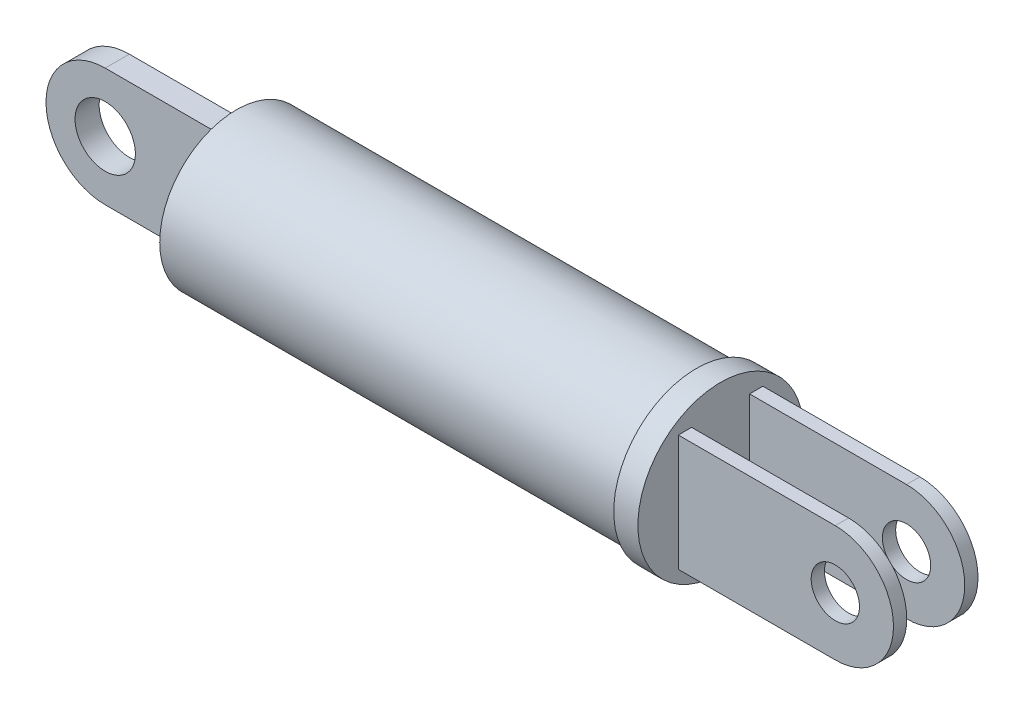
ISO-10303-21;
HEADER;
FILE_DESCRIPTION(('STEP AP214'),'2;1');
FILE_NAME('part.step','',(''),(''),'','','');
FILE_SCHEMA(('AUTOMOTIVE_DESIGN { 1 0 10303 214 1 1 1 1 }'));
ENDSEC;
DATA;
#1=APPLICATION_CONTEXT('core data for automotive mechanical design processes');
#2=APPLICATION_PROTOCOL_DEFINITION('international standard','automotive_design',2000,#1);
#3=PRODUCT_CONTEXT('',#1,'mechanical');
#4=PRODUCT('Part','Part','',(#3));
#5=PRODUCT_RELATED_PRODUCT_CATEGORY('part','',(#4));
#6=PRODUCT_DEFINITION_FORMATION('','',#4);
#7=PRODUCT_DEFINITION_CONTEXT('part definition',#1,'design');
#8=PRODUCT_DEFINITION('design','',#6,#7);
#9=PRODUCT_DEFINITION_SHAPE('','',#8);
#10=(LENGTH_UNIT() NAMED_UNIT(*) SI_UNIT(.MILLI.,.METRE.));
#11=(NAMED_UNIT(*) PLANE_ANGLE_UNIT() SI_UNIT($,.RADIAN.));
#12=(NAMED_UNIT(*) SI_UNIT($,.STERADIAN.) SOLID_ANGLE_UNIT());
#13=UNCERTAINTY_MEASURE_WITH_UNIT(LENGTH_MEASURE(1.E-05),#10,'distance_accuracy_value','');
#14=(GEOMETRIC_REPRESENTATION_CONTEXT(3) GLOBAL_UNCERTAINTY_ASSIGNED_CONTEXT((#13)) GLOBAL_UNIT_ASSIGNED_CONTEXT((#10,
#11,#12)) REPRESENTATION_CONTEXT('',''));
#15=CARTESIAN_POINT('',(0.,0.,0.));
#16=DIRECTION('',(0.,0.,1.));
#17=DIRECTION('',(1.,0.,0.));
#18=AXIS2_PLACEMENT_3D('',#15,#16,#17);
#19=CARTESIAN_POINT('',(80.2,-9.63566644208569,7.));
#20=DIRECTION('',(0.,1.,0.));
#21=DIRECTION('',(0.,0.,1.));
#22=AXIS2_PLACEMENT_3D('',#19,#20,#21);
#23=PLANE('',#22);
#24=DIRECTION('',(0.,0.,-1.));
#25=VECTOR('',#24,1.);
#26=CARTESIAN_POINT('',(106.2,-9.63566644208569,7.));
#27=LINE('',#26,#25);
#28=CARTESIAN_POINT('',(106.2,-9.63566644208569,-4.80121317375935));
#29=VERTEX_POINT('',#28);
#30=CARTESIAN_POINT('',(106.2,-9.63566644208569,-7.));
#31=VERTEX_POINT('',#30);
#32=EDGE_CURVE('E316',#29,#31,#27,.T.);
#33=ORIENTED_EDGE('',*,*,#32,.F.);
#34=DIRECTION('',(-1.,0.,0.));
#35=VECTOR('',#34,1.);
#36=CARTESIAN_POINT('',(80.2,-9.63566644208569,-4.80121317375934));
#37=LINE('',#36,#35);
#38=CARTESIAN_POINT('',(80.2,-9.63566644208569,-4.80121317375934));
#39=VERTEX_POINT('',#38);
#40=EDGE_CURVE('E278',#29,#39,#37,.T.);
#41=ORIENTED_EDGE('',*,*,#40,.T.);
#42=DIRECTION('',(0.,0.,-1.));
#43=VECTOR('',#42,1.);
#44=CARTESIAN_POINT('',(80.2,-9.63566644208569,7.));
#45=LINE('',#44,#43);
#46=CARTESIAN_POINT('',(80.2,-9.63566644208569,-7.));
#47=VERTEX_POINT('',#46);
#48=EDGE_CURVE('E185',#39,#47,#45,.T.);
#49=ORIENTED_EDGE('',*,*,#48,.T.);
#50=DIRECTION('',(1.,0.,0.));
#51=VECTOR('',#50,1.);
#52=CARTESIAN_POINT('',(80.2,-9.63566644208569,-7.));
#53=LINE('',#52,#51);
#54=EDGE_CURVE('E300',#47,#31,#53,.T.);
#55=ORIENTED_EDGE('',*,*,#54,.T.);
#56=EDGE_LOOP('',(#33,#41,#49,#55));
#57=FACE_BOUND('',#56,.T.);
#58=ADVANCED_FACE('F42',(#57),#23,.F.);
#59=CARTESIAN_POINT('',(106.2,0.,7.));
#60=DIRECTION('',(0.,0.,-1.));
#61=DIRECTION('',(-1.,0.,0.));
#62=AXIS2_PLACEMENT_3D('',#59,#60,#61);
#63=CYLINDRICAL_SURFACE('',#62,9.63566644208569);
#64=DIRECTION('',(0.,0.,-1.));
#65=VECTOR('',#64,1.);
#66=CARTESIAN_POINT('',(106.2,9.63566644208569,7.));
#67=LINE('',#66,#65);
#68=CARTESIAN_POINT('',(106.2,9.63566644208569,-4.80121317375935));
#69=VERTEX_POINT('',#68);
#70=CARTESIAN_POINT('',(106.2,9.63566644208569,-7.));
#71=VERTEX_POINT('',#70);
#72=EDGE_CURVE('E312',#69,#71,#67,.T.);
#73=ORIENTED_EDGE('',*,*,#72,.F.);
#74=CARTESIAN_POINT('',(106.2,0.,-4.80121317375935));
#75=DIRECTION('',(0.,0.,-1.));
#76=DIRECTION('',(-1.,0.,0.));
#77=AXIS2_PLACEMENT_3D('',#74,#75,#76);
#78=CIRCLE('',#77,9.63566644208569);
#79=EDGE_CURVE('E274',#69,#29,#78,.T.);
#80=ORIENTED_EDGE('',*,*,#79,.T.);
#81=ORIENTED_EDGE('',*,*,#32,.T.);
#82=CARTESIAN_POINT('',(106.2,0.,-7.));
#83=DIRECTION('',(0.,0.,1.));
#84=DIRECTION('',(-1.,0.,0.));
#85=AXIS2_PLACEMENT_3D('',#82,#83,#84);
#86=CIRCLE('',#85,9.63566644208569);
#87=EDGE_CURVE('E304',#31,#71,#86,.T.);
#88=ORIENTED_EDGE('',*,*,#87,.T.);
#89=EDGE_LOOP('',(#73,#80,#81,#88));
#90=FACE_BOUND('',#89,.T.);
#91=ADVANCED_FACE('F328',(#90),#63,.T.);
#92=CARTESIAN_POINT('',(80.2,9.63566644208569,7.));
#93=DIRECTION('',(0.,-1.,0.));
#94=DIRECTION('',(0.,0.,-1.));
#95=AXIS2_PLACEMENT_3D('',#92,#93,#94);
#96=PLANE('',#95);
#97=DIRECTION('',(0.,0.,-1.));
#98=VECTOR('',#97,1.);
#99=CARTESIAN_POINT('',(80.2,9.63566644208569,7.));
#100=LINE('',#99,#98);
#101=CARTESIAN_POINT('',(80.2,9.63566644208569,-4.80121317375934));
#102=VERTEX_POINT('',#101);
#103=CARTESIAN_POINT('',(80.2,9.63566644208569,-7.));
#104=VERTEX_POINT('',#103);
#105=EDGE_CURVE('E74',#102,#104,#100,.T.);
#106=ORIENTED_EDGE('',*,*,#105,.F.);
#107=DIRECTION('',(1.,0.,0.));
#108=VECTOR('',#107,1.);
#109=CARTESIAN_POINT('',(80.2,9.63566644208569,-4.80121317375934));
#110=LINE('',#109,#108);
#111=EDGE_CURVE('E270',#102,#69,#110,.T.);
#112=ORIENTED_EDGE('',*,*,#111,.T.);
#113=ORIENTED_EDGE('',*,*,#72,.T.);
#114=DIRECTION('',(-1.,0.,0.));
#115=VECTOR('',#114,1.);
#116=CARTESIAN_POINT('',(80.2,9.63566644208569,-7.));
#117=LINE('',#116,#115);
#118=EDGE_CURVE('E292',#71,#104,#117,.T.);
#119=ORIENTED_EDGE('',*,*,#118,.T.);
#120=EDGE_LOOP('',(#106,#112,#113,#119));
#121=FACE_BOUND('',#120,.T.);
#122=ADVANCED_FACE('F324',(#121),#96,.F.);
#123=CARTESIAN_POINT('',(106.2,0.,7.));
#124=DIRECTION('',(0.,0.,-1.));
#125=DIRECTION('',(-1.,0.,0.));
#126=AXIS2_PLACEMENT_3D('',#123,#124,#125);
#127=CYLINDRICAL_SURFACE('',#126,4.00000000000001);
#128=CARTESIAN_POINT('',(106.2,0.,-4.80121317375935));
#129=DIRECTION('',(0.,0.,-1.));
#130=DIRECTION('',(-1.,0.,0.));
#131=AXIS2_PLACEMENT_3D('',#128,#129,#130);
#132=CIRCLE('',#131,4.00000000000001);
#133=CARTESIAN_POINT('',(102.2,0.,-4.80121317375935));
#134=VERTEX_POINT('',#133);
#135=EDGE_CURVE('E46',#134,#134,#132,.T.);
#136=ORIENTED_EDGE('',*,*,#135,.F.);
#137=EDGE_LOOP('',(#136));
#138=FACE_BOUND('',#137,.T.);
#139=CARTESIAN_POINT('',(106.2,0.,-7.));
#140=DIRECTION('',(0.,0.,1.));
#141=DIRECTION('',(1.,0.,0.));
#142=AXIS2_PLACEMENT_3D('',#139,#140,#141);
#143=CIRCLE('',#142,4.00000000000001);
#144=CARTESIAN_POINT('',(110.2,0.,-7.));
#145=VERTEX_POINT('',#144);
#146=EDGE_CURVE('E282',#145,#145,#143,.T.);
#147=ORIENTED_EDGE('',*,*,#146,.F.);
#148=EDGE_LOOP('',(#147));
#149=FACE_BOUND('',#148,.T.);
#150=ADVANCED_FACE('F349',(#138,#149),#127,.F.);
#151=CARTESIAN_POINT('',(80.2,0.,0.));
#152=DIRECTION('',(1.,0.,0.));
#153=DIRECTION('',(0.,0.,-1.));
#154=AXIS2_PLACEMENT_3D('',#151,#152,#153);
#155=PLANE('',#154);
#156=ORIENTED_EDGE('',*,*,#48,.F.);
#157=DIRECTION('',(0.,1.,0.));
#158=VECTOR('',#157,1.);
#159=CARTESIAN_POINT('',(80.2,-13.7,-4.80121317375934));
#160=LINE('',#159,#158);
#161=EDGE_CURVE('E178',#39,#102,#160,.T.);
#162=ORIENTED_EDGE('',*,*,#161,.T.);
#163=ORIENTED_EDGE('',*,*,#105,.T.);
#164=DIRECTION('',(0.,-1.,0.));
#165=VECTOR('',#164,1.);
#166=CARTESIAN_POINT('',(80.2,9.63566644208569,-7.));
#167=LINE('',#166,#165);
#168=EDGE_CURVE('E286',#104,#47,#167,.T.);
#169=ORIENTED_EDGE('',*,*,#168,.T.);
#170=EDGE_LOOP('',(#156,#162,#163,#169));
#171=FACE_BOUND('',#170,.T.);
#172=CARTESIAN_POINT('',(80.2,9.63566644208569,7.));
#173=VERTEX_POINT('',#172);
#174=CARTESIAN_POINT('',(80.2,9.63566644208569,4.80121317375941));
#175=VERTEX_POINT('',#174);
#176=EDGE_CURVE('E176',#173,#175,#100,.T.);
#177=ORIENTED_EDGE('',*,*,#176,.T.);
#178=DIRECTION('',(0.,1.,0.));
#179=VECTOR('',#178,1.);
#180=CARTESIAN_POINT('',(80.2,-13.7,4.80121317375941));
#181=LINE('',#180,#179);
#182=CARTESIAN_POINT('',(80.2,-9.63566644208569,4.80121317375941));
#183=VERTEX_POINT('',#182);
#184=EDGE_CURVE('E63',#183,#175,#181,.T.);
#185=ORIENTED_EDGE('',*,*,#184,.F.);
#186=CARTESIAN_POINT('',(80.2,-9.63566644208569,7.));
#187=VERTEX_POINT('',#186);
#188=EDGE_CURVE('E174',#187,#183,#45,.T.);
#189=ORIENTED_EDGE('',*,*,#188,.F.);
#190=DIRECTION('',(0.,-1.,0.));
#191=VECTOR('',#190,1.);
#192=CARTESIAN_POINT('',(80.2,9.63566644208569,7.));
#193=LINE('',#192,#191);
#194=EDGE_CURVE('E290',#173,#187,#193,.T.);
#195=ORIENTED_EDGE('',*,*,#194,.F.);
#196=EDGE_LOOP('',(#177,#185,#189,#195));
#197=FACE_BOUND('',#196,.T.);
#198=CARTESIAN_POINT('',(80.2,0.,0.));
#199=DIRECTION('',(1.,0.,0.));
#200=DIRECTION('',(0.,0.,-1.));
#201=AXIS2_PLACEMENT_3D('',#198,#199,#200);
#202=CIRCLE('',#201,13.7);
#203=CARTESIAN_POINT('',(80.2,0.,-13.7));
#204=VERTEX_POINT('',#203);
#205=EDGE_CURVE('E191',#204,#204,#202,.T.);
#206=ORIENTED_EDGE('',*,*,#205,.T.);
#207=EDGE_LOOP('',(#206));
#208=FACE_BOUND('',#207,.T.);
#209=ADVANCED_FACE('F171',(#171,#197,#208),#155,.T.);
#210=CARTESIAN_POINT('',(0.,0.,0.));
#211=DIRECTION('',(1.,0.,0.));
#212=DIRECTION('',(0.,0.,-1.));
#213=AXIS2_PLACEMENT_3D('',#210,#211,#212);
#214=PLANE('',#213);
#215=CARTESIAN_POINT('',(0.,0.,0.));
#216=DIRECTION('',(1.,0.,0.));
#217=DIRECTION('',(0.,0.,-1.));
#218=AXIS2_PLACEMENT_3D('',#215,#216,#217);
#219=CIRCLE('',#218,12.7);
#220=CARTESIAN_POINT('',(0.,0.,12.7));
#221=VERTEX_POINT('',#220);
#222=EDGE_CURVE('E52',#221,#221,#219,.T.);
#223=ORIENTED_EDGE('',*,*,#222,.F.);
#224=EDGE_LOOP('',(#223));
#225=FACE_BOUND('',#224,.T.);
#226=DIRECTION('',(0.,0.,-1.));
#227=VECTOR('',#226,1.);
#228=CARTESIAN_POINT('',(0.,9.80568754770044,2.));
#229=LINE('',#228,#227);
#230=CARTESIAN_POINT('',(0.,9.80568754770044,2.));
#231=VERTEX_POINT('',#230);
#232=CARTESIAN_POINT('',(0.,9.80568754770044,-2.));
#233=VERTEX_POINT('',#232);
#234=EDGE_CURVE('E247',#231,#233,#229,.T.);
#235=ORIENTED_EDGE('',*,*,#234,.F.);
#236=DIRECTION('',(0.,1.,0.));
#237=VECTOR('',#236,1.);
#238=CARTESIAN_POINT('',(0.,9.80568754770044,2.));
#239=LINE('',#238,#237);
#240=CARTESIAN_POINT('',(0.,-9.80568754770044,2.));
#241=VERTEX_POINT('',#240);
#242=EDGE_CURVE('E210',#241,#231,#239,.T.);
#243=ORIENTED_EDGE('',*,*,#242,.F.);
#244=DIRECTION('',(0.,0.,-1.));
#245=VECTOR('',#244,1.);
#246=CARTESIAN_POINT('',(0.,-9.80568754770044,2.));
#247=LINE('',#246,#245);
#248=CARTESIAN_POINT('',(0.,-9.80568754770044,-2.));
#249=VERTEX_POINT('',#248);
#250=EDGE_CURVE('E225',#241,#249,#247,.T.);
#251=ORIENTED_EDGE('',*,*,#250,.T.);
#252=DIRECTION('',(0.,1.,0.));
#253=VECTOR('',#252,1.);
#254=CARTESIAN_POINT('',(0.,9.80568754770044,-2.));
#255=LINE('',#254,#253);
#256=EDGE_CURVE('E206',#249,#233,#255,.T.);
#257=ORIENTED_EDGE('',*,*,#256,.T.);
#258=EDGE_LOOP('',(#235,#243,#251,#257));
#259=FACE_BOUND('',#258,.T.);
#260=ADVANCED_FACE('F385',(#225,#259),#214,.F.);
#261=CARTESIAN_POINT('',(76.2,0.,0.));
#262=DIRECTION('',(-1.,0.,0.));
#263=DIRECTION('',(0.,0.,1.));
#264=AXIS2_PLACEMENT_3D('',#261,#262,#263);
#265=CYLINDRICAL_SURFACE('',#264,12.7);
#266=CARTESIAN_POINT('',(76.2,0.,0.));
#267=DIRECTION('',(1.,0.,0.));
#268=DIRECTION('',(0.,0.,-1.));
#269=AXIS2_PLACEMENT_3D('',#266,#267,#268);
#270=CIRCLE('',#269,12.7);
#271=CARTESIAN_POINT('',(76.2,0.,12.7));
#272=VERTEX_POINT('',#271);
#273=EDGE_CURVE('E11',#272,#272,#270,.T.);
#274=CARTESIAN_POINT('',(76.2,0.,12.7));
#275=CARTESIAN_POINT('',(75.40625,0.,12.7));
#276=CARTESIAN_POINT('',(74.6125,0.,12.7));
#277=CARTESIAN_POINT('',(73.025,0.,12.7));
#278=CARTESIAN_POINT('',(72.23125,0.,12.7));
#279=CARTESIAN_POINT('',(70.64375,0.,12.7));
#280=CARTESIAN_POINT('',(69.85,0.,12.7));
#281=CARTESIAN_POINT('',(68.2625,0.,12.7));
#282=CARTESIAN_POINT('',(67.46875,0.,12.7));
#283=CARTESIAN_POINT('',(65.88125,0.,12.7));
#284=CARTESIAN_POINT('',(65.0875,0.,12.7));
#285=CARTESIAN_POINT('',(63.5,0.,12.7));
#286=CARTESIAN_POINT('',(62.70625,0.,12.7));
#287=CARTESIAN_POINT('',(61.11875,0.,12.7));
#288=CARTESIAN_POINT('',(60.325,0.,12.7));
#289=CARTESIAN_POINT('',(58.7375,0.,12.7));
#290=CARTESIAN_POINT('',(57.94375,0.,12.7));
#291=CARTESIAN_POINT('',(56.35625,0.,12.7));
#292=CARTESIAN_POINT('',(55.5625,0.,12.7));
#293=CARTESIAN_POINT('',(53.975,0.,12.7));
#294=CARTESIAN_POINT('',(53.18125,0.,12.7));
#295=CARTESIAN_POINT('',(51.59375,0.,12.7));
#296=CARTESIAN_POINT('',(50.8,0.,12.7));
#297=CARTESIAN_POINT('',(49.2125,0.,12.7));
#298=CARTESIAN_POINT('',(48.41875,0.,12.7));
#299=CARTESIAN_POINT('',(46.83125,0.,12.7));
#300=CARTESIAN_POINT('',(46.0375,0.,12.7));
#301=CARTESIAN_POINT('',(44.45,0.,12.7));
#302=CARTESIAN_POINT('',(43.65625,0.,12.7));
#303=CARTESIAN_POINT('',(42.06875,0.,12.7));
#304=CARTESIAN_POINT('',(41.275,0.,12.7));
#305=CARTESIAN_POINT('',(39.6875,0.,12.7));
#306=CARTESIAN_POINT('',(38.89375,0.,12.7));
#307=CARTESIAN_POINT('',(37.30625,0.,12.7));
#308=CARTESIAN_POINT('',(36.5125,0.,12.7));
#309=CARTESIAN_POINT('',(34.925,0.,12.7));
#310=CARTESIAN_POINT('',(34.13125,0.,12.7));
#311=CARTESIAN_POINT('',(32.54375,0.,12.7));
#312=CARTESIAN_POINT('',(31.75,0.,12.7));
#313=CARTESIAN_POINT('',(30.1625,0.,12.7));
#314=CARTESIAN_POINT('',(29.36875,0.,12.7));
#315=CARTESIAN_POINT('',(27.78125,0.,12.7));
#316=CARTESIAN_POINT('',(26.9875,0.,12.7));
#317=CARTESIAN_POINT('',(25.4,0.,12.7));
#318=CARTESIAN_POINT('',(24.60625,0.,12.7));
#319=CARTESIAN_POINT('',(23.01875,0.,12.7));
#320=CARTESIAN_POINT('',(22.225,0.,12.7));
#321=CARTESIAN_POINT('',(20.6375,0.,12.7));
#322=CARTESIAN_POINT('',(19.84375,0.,12.7));
#323=CARTESIAN_POINT('',(18.25625,0.,12.7));
#324=CARTESIAN_POINT('',(17.4625,0.,12.7));
#325=CARTESIAN_POINT('',(15.875,0.,12.7));
#326=CARTESIAN_POINT('',(15.08125,0.,12.7));
#327=CARTESIAN_POINT('',(13.49375,0.,12.7));
#328=CARTESIAN_POINT('',(12.7,0.,12.7));
#329=CARTESIAN_POINT('',(11.1125,0.,12.7));
#330=CARTESIAN_POINT('',(10.31875,0.,12.7));
#331=CARTESIAN_POINT('',(8.73125,0.,12.7));
#332=CARTESIAN_POINT('',(7.93750000000001,0.,12.7));
#333=CARTESIAN_POINT('',(6.35,0.,12.7));
#334=CARTESIAN_POINT('',(5.55625,0.,12.7));
#335=CARTESIAN_POINT('',(3.96875,0.,12.7));
#336=CARTESIAN_POINT('',(3.175,0.,12.7));
#337=CARTESIAN_POINT('',(1.5875,0.,12.7));
#338=CARTESIAN_POINT('',(0.793750000000001,0.,12.7));
#339=CARTESIAN_POINT('',(0.,0.,12.7));
#340=B_SPLINE_CURVE_WITH_KNOTS('',3,(#274,#275,#276,#277,#278,#279,#280,#281,#282,#283,#284,
#285,#286,#287,#288,#289,#290,#291,#292,#293,#294,#295,#296,#297,#298,#299,#300,#301,#302,#303,
#304,#305,#306,#307,#308,#309,#310,#311,#312,#313,#314,#315,#316,#317,#318,#319,#320,#321,#322,
#323,#324,#325,#326,#327,#328,#329,#330,#331,#332,#333,#334,#335,#336,#337,#338,#339),
.UNSPECIFIED.,.F.,.F.,(4,2,2,2,2,2,2,2,2,2,2,2,2,2,2,2,2,2,2,2,2,2,2,2,2,2,2,2,2,2,2,2,4),(0.,
2.38124999999999,4.76249999999999,7.14374999999999,9.52499999999999,11.90625,14.2875,16.66875,
19.05,21.43125,23.8125,26.19375,28.575,30.95625,33.3375,35.71875,38.1,40.48125,42.8625,45.24375,
47.625,50.00625,52.3875,54.76875,57.15,59.53125,61.9125,64.29375,66.675,69.05625,71.4375,
73.81875,76.2),.UNSPECIFIED.);
#341=EDGE_CURVE('BSEAM44',#272,#221,#340,.T.);
#342=ORIENTED_EDGE('',*,*,#273,.F.);
#343=ORIENTED_EDGE('',*,*,#222,.T.);
#344=ORIENTED_EDGE('',*,*,#341,.T.);
#345=ORIENTED_EDGE('',*,*,#341,.F.);
#346=EDGE_LOOP('',(#342,#344,#343,#345));
#347=FACE_BOUND('',#346,.T.);
#348=ADVANCED_FACE('F44',(#347),#265,.T.);
#349=CARTESIAN_POINT('',(-19.7330944718316,0.,2.));
#350=DIRECTION('',(0.,0.,1.));
#351=DIRECTION('',(1.,0.,0.));
#352=AXIS2_PLACEMENT_3D('',#349,#350,#351);
#353=PLANE('',#352);
#354=ORIENTED_EDGE('',*,*,#242,.T.);
#355=DIRECTION('',(-1.,0.,0.));
#356=VECTOR('',#355,1.);
#357=CARTESIAN_POINT('',(0.,9.80568754770044,2.));
#358=LINE('',#357,#356);
#359=CARTESIAN_POINT('',(-19.7330944718316,9.80568754770044,2.));
#360=VERTEX_POINT('',#359);
#361=EDGE_CURVE('E214',#231,#360,#358,.T.);
#362=ORIENTED_EDGE('',*,*,#361,.T.);
#363=CARTESIAN_POINT('',(-19.7330944718316,0.,2.));
#364=DIRECTION('',(0.,0.,1.));
#365=DIRECTION('',(1.,0.,0.));
#366=AXIS2_PLACEMENT_3D('',#363,#364,#365);
#367=CIRCLE('',#366,9.80568754770044);
#368=CARTESIAN_POINT('',(-19.7330944718316,-9.80568754770044,2.));
#369=VERTEX_POINT('',#368);
#370=EDGE_CURVE('E218',#360,#369,#367,.T.);
#371=ORIENTED_EDGE('',*,*,#370,.T.);
#372=DIRECTION('',(1.,0.,0.));
#373=VECTOR('',#372,1.);
#374=CARTESIAN_POINT('',(0.,-9.80568754770044,2.));
#375=LINE('',#374,#373);
#376=EDGE_CURVE('E221',#369,#241,#375,.T.);
#377=ORIENTED_EDGE('',*,*,#376,.T.);
#378=EDGE_LOOP('',(#354,#362,#371,#377));
#379=FACE_BOUND('',#378,.T.);
#380=CARTESIAN_POINT('',(-19.7330944718316,0.,2.));
#381=DIRECTION('',(0.,0.,1.));
#382=DIRECTION('',(1.,0.,0.));
#383=AXIS2_PLACEMENT_3D('',#380,#381,#382);
#384=CIRCLE('',#383,5.);
#385=CARTESIAN_POINT('',(-14.7330944718316,0.,2.));
#386=VERTEX_POINT('',#385);
#387=EDGE_CURVE('E202',#386,#386,#384,.T.);
#388=ORIENTED_EDGE('',*,*,#387,.F.);
#389=EDGE_LOOP('',(#388));
#390=FACE_BOUND('',#389,.T.);
#391=ADVANCED_FACE('F413',(#379,#390),#353,.T.);
#392=CARTESIAN_POINT('',(-19.7330944718316,0.,-2.));
#393=DIRECTION('',(0.,0.,1.));
#394=DIRECTION('',(1.,0.,0.));
#395=AXIS2_PLACEMENT_3D('',#392,#393,#394);
#396=PLANE('',#395);
#397=ORIENTED_EDGE('',*,*,#256,.F.);
#398=DIRECTION('',(1.,0.,0.));
#399=VECTOR('',#398,1.);
#400=CARTESIAN_POINT('',(0.,-9.80568754770044,-2.));
#401=LINE('',#400,#399);
#402=CARTESIAN_POINT('',(-19.7330944718316,-9.80568754770044,-2.));
#403=VERTEX_POINT('',#402);
#404=EDGE_CURVE('E215',#403,#249,#401,.T.);
#405=ORIENTED_EDGE('',*,*,#404,.F.);
#406=CARTESIAN_POINT('',(-19.7330944718316,0.,-2.));
#407=DIRECTION('',(0.,0.,1.));
#408=DIRECTION('',(1.,0.,0.));
#409=AXIS2_PLACEMENT_3D('',#406,#407,#408);
#410=CIRCLE('',#409,9.80568754770044);
#411=CARTESIAN_POINT('',(-19.7330944718316,9.80568754770044,-2.));
#412=VERTEX_POINT('',#411);
#413=EDGE_CURVE('E231',#412,#403,#410,.T.);
#414=ORIENTED_EDGE('',*,*,#413,.F.);
#415=DIRECTION('',(-1.,0.,0.));
#416=VECTOR('',#415,1.);
#417=CARTESIAN_POINT('',(0.,9.80568754770044,-2.));
#418=LINE('',#417,#416);
#419=EDGE_CURVE('E228',#233,#412,#418,.T.);
#420=ORIENTED_EDGE('',*,*,#419,.F.);
#421=EDGE_LOOP('',(#397,#405,#414,#420));
#422=FACE_BOUND('',#421,.T.);
#423=CARTESIAN_POINT('',(-19.7330944718316,0.,-2.));
#424=DIRECTION('',(0.,0.,1.));
#425=DIRECTION('',(1.,0.,0.));
#426=AXIS2_PLACEMENT_3D('',#423,#424,#425);
#427=CIRCLE('',#426,5.);
#428=CARTESIAN_POINT('',(-14.7330944718316,0.,-2.));
#429=VERTEX_POINT('',#428);
#430=EDGE_CURVE('E200',#429,#429,#427,.T.);
#431=ORIENTED_EDGE('',*,*,#430,.T.);
#432=EDGE_LOOP('',(#431));
#433=FACE_BOUND('',#432,.T.);
#434=ADVANCED_FACE('F416',(#422,#433),#396,.F.);
#435=CARTESIAN_POINT('',(0.,9.80568754770044,2.));
#436=DIRECTION('',(0.,-1.,0.));
#437=DIRECTION('',(1.,0.,0.));
#438=AXIS2_PLACEMENT_3D('',#435,#436,#437);
#439=PLANE('',#438);
#440=ORIENTED_EDGE('',*,*,#419,.T.);
#441=DIRECTION('',(0.,0.,-1.));
#442=VECTOR('',#441,1.);
#443=CARTESIAN_POINT('',(-19.7330944718316,9.80568754770044,2.));
#444=LINE('',#443,#442);
#445=EDGE_CURVE('E243',#360,#412,#444,.T.);
#446=ORIENTED_EDGE('',*,*,#445,.F.);
#447=ORIENTED_EDGE('',*,*,#361,.F.);
#448=ORIENTED_EDGE('',*,*,#234,.T.);
#449=EDGE_LOOP('',(#440,#446,#447,#448));
#450=FACE_BOUND('',#449,.T.);
#451=ADVANCED_FACE('F420',(#450),#439,.F.);
#452=CARTESIAN_POINT('',(-19.7330944718316,0.,2.));
#453=DIRECTION('',(0.,0.,-1.));
#454=DIRECTION('',(-1.,0.,0.));
#455=AXIS2_PLACEMENT_3D('',#452,#453,#454);
#456=CYLINDRICAL_SURFACE('',#455,9.80568754770044);
#457=ORIENTED_EDGE('',*,*,#413,.T.);
#458=DIRECTION('',(0.,0.,-1.));
#459=VECTOR('',#458,1.);
#460=CARTESIAN_POINT('',(-19.7330944718316,-9.80568754770044,2.));
#461=LINE('',#460,#459);
#462=EDGE_CURVE('E239',#369,#403,#461,.T.);
#463=ORIENTED_EDGE('',*,*,#462,.F.);
#464=ORIENTED_EDGE('',*,*,#370,.F.);
#465=ORIENTED_EDGE('',*,*,#445,.T.);
#466=EDGE_LOOP('',(#457,#463,#464,#465));
#467=FACE_BOUND('',#466,.T.);
#468=ADVANCED_FACE('F424',(#467),#456,.T.);
#469=CARTESIAN_POINT('',(0.,-9.80568754770044,2.));
#470=DIRECTION('',(0.,1.,0.));
#471=DIRECTION('',(-1.,0.,0.));
#472=AXIS2_PLACEMENT_3D('',#469,#470,#471);
#473=PLANE('',#472);
#474=ORIENTED_EDGE('',*,*,#404,.T.);
#475=ORIENTED_EDGE('',*,*,#250,.F.);
#476=ORIENTED_EDGE('',*,*,#376,.F.);
#477=ORIENTED_EDGE('',*,*,#462,.T.);
#478=EDGE_LOOP('',(#474,#475,#476,#477));
#479=FACE_BOUND('',#478,.T.);
#480=ADVANCED_FACE('F411',(#479),#473,.F.);
#481=CARTESIAN_POINT('',(-19.7330944718316,0.,2.));
#482=DIRECTION('',(0.,0.,-1.));
#483=DIRECTION('',(-1.,0.,0.));
#484=AXIS2_PLACEMENT_3D('',#481,#482,#483);
#485=CYLINDRICAL_SURFACE('',#484,5.);
#486=ORIENTED_EDGE('',*,*,#387,.T.);
#487=EDGE_LOOP('',(#486));
#488=FACE_BOUND('',#487,.T.);
#489=ORIENTED_EDGE('',*,*,#430,.F.);
#490=EDGE_LOOP('',(#489));
#491=FACE_BOUND('',#490,.T.);
#492=ADVANCED_FACE('F404',(#488,#491),#485,.F.);
#493=CARTESIAN_POINT('',(76.2,0.,0.));
#494=DIRECTION('',(1.,0.,0.));
#495=DIRECTION('',(0.,0.,-1.));
#496=AXIS2_PLACEMENT_3D('',#493,#494,#495);
#497=PLANE('',#496);
#498=CARTESIAN_POINT('',(76.2,0.,0.));
#499=DIRECTION('',(1.,0.,0.));
#500=DIRECTION('',(0.,0.,-1.));
#501=AXIS2_PLACEMENT_3D('',#498,#499,#500);
#502=CIRCLE('',#501,13.7);
#503=CARTESIAN_POINT('',(76.2,0.,-13.7));
#504=VERTEX_POINT('',#503);
#505=EDGE_CURVE('E184',#504,#504,#502,.T.);
#506=ORIENTED_EDGE('',*,*,#505,.F.);
#507=EDGE_LOOP('',(#506));
#508=FACE_BOUND('',#507,.T.);
#509=ORIENTED_EDGE('',*,*,#273,.T.);
#510=EDGE_LOOP('',(#509));
#511=FACE_BOUND('',#510,.T.);
#512=ADVANCED_FACE('F401',(#508,#511),#497,.F.);
#513=CARTESIAN_POINT('',(80.2,0.,0.));
#514=DIRECTION('',(-1.,0.,0.));
#515=DIRECTION('',(0.,0.,1.));
#516=AXIS2_PLACEMENT_3D('',#513,#514,#515);
#517=CYLINDRICAL_SURFACE('',#516,13.7);
#518=ORIENTED_EDGE('',*,*,#205,.F.);
#519=EDGE_LOOP('',(#518));
#520=FACE_BOUND('',#519,.T.);
#521=ORIENTED_EDGE('',*,*,#505,.T.);
#522=EDGE_LOOP('',(#521));
#523=FACE_BOUND('',#522,.T.);
#524=ADVANCED_FACE('F370',(#520,#523),#517,.T.);
#525=CARTESIAN_POINT('',(106.2,0.,7.));
#526=DIRECTION('',(0.,0.,-1.));
#527=DIRECTION('',(-1.,0.,0.));
#528=AXIS2_PLACEMENT_3D('',#525,#526,#527);
#529=PLANE('',#528);
#530=ORIENTED_EDGE('',*,*,#194,.T.);
#531=DIRECTION('',(1.,0.,0.));
#532=VECTOR('',#531,1.);
#533=CARTESIAN_POINT('',(80.2,-9.63566644208569,7.));
#534=LINE('',#533,#532);
#535=CARTESIAN_POINT('',(106.2,-9.63566644208569,7.));
#536=VERTEX_POINT('',#535);
#537=EDGE_CURVE('E181',#187,#536,#534,.T.);
#538=ORIENTED_EDGE('',*,*,#537,.T.);
#539=CARTESIAN_POINT('',(106.2,0.,7.));
#540=DIRECTION('',(0.,0.,1.));
#541=DIRECTION('',(-1.,0.,0.));
#542=AXIS2_PLACEMENT_3D('',#539,#540,#541);
#543=CIRCLE('',#542,9.63566644208569);
#544=CARTESIAN_POINT('',(106.2,9.63566644208569,7.));
#545=VERTEX_POINT('',#544);
#546=EDGE_CURVE('E294',#536,#545,#543,.T.);
#547=ORIENTED_EDGE('',*,*,#546,.T.);
#548=DIRECTION('',(-1.,0.,0.));
#549=VECTOR('',#548,1.);
#550=CARTESIAN_POINT('',(80.2,9.63566644208569,7.));
#551=LINE('',#550,#549);
#552=EDGE_CURVE('E296',#545,#173,#551,.T.);
#553=ORIENTED_EDGE('',*,*,#552,.T.);
#554=EDGE_LOOP('',(#530,#538,#547,#553));
#555=FACE_BOUND('',#554,.T.);
#556=CARTESIAN_POINT('',(106.2,0.,7.));
#557=DIRECTION('',(0.,0.,1.));
#558=DIRECTION('',(1.,0.,0.));
#559=AXIS2_PLACEMENT_3D('',#556,#557,#558);
#560=CIRCLE('',#559,4.00000000000001);
#561=CARTESIAN_POINT('',(110.2,0.,7.));
#562=VERTEX_POINT('',#561);
#563=EDGE_CURVE('E283',#562,#562,#560,.T.);
#564=ORIENTED_EDGE('',*,*,#563,.F.);
#565=EDGE_LOOP('',(#564));
#566=FACE_BOUND('',#565,.T.);
#567=ADVANCED_FACE('F365',(#555,#566),#529,.F.);
#568=CARTESIAN_POINT('',(106.2,0.,-7.));
#569=DIRECTION('',(0.,0.,-1.));
#570=DIRECTION('',(-1.,0.,0.));
#571=AXIS2_PLACEMENT_3D('',#568,#569,#570);
#572=PLANE('',#571);
#573=ORIENTED_EDGE('',*,*,#168,.F.);
#574=ORIENTED_EDGE('',*,*,#118,.F.);
#575=ORIENTED_EDGE('',*,*,#87,.F.);
#576=ORIENTED_EDGE('',*,*,#54,.F.);
#577=EDGE_LOOP('',(#573,#574,#575,#576));
#578=FACE_BOUND('',#577,.T.);
#579=ORIENTED_EDGE('',*,*,#146,.T.);
#580=EDGE_LOOP('',(#579));
#581=FACE_BOUND('',#580,.T.);
#582=ADVANCED_FACE('F332',(#578,#581),#572,.T.);
#583=ORIENTED_EDGE('',*,*,#188,.T.);
#584=DIRECTION('',(1.,0.,0.));
#585=VECTOR('',#584,1.);
#586=CARTESIAN_POINT('',(80.2,-9.63566644208569,4.80121317375941));
#587=LINE('',#586,#585);
#588=CARTESIAN_POINT('',(106.2,-9.63566644208569,4.80121317375941));
#589=VERTEX_POINT('',#588);
#590=EDGE_CURVE('E158',#183,#589,#587,.T.);
#591=ORIENTED_EDGE('',*,*,#590,.T.);
#592=EDGE_CURVE('E194',#536,#589,#27,.T.);
#593=ORIENTED_EDGE('',*,*,#592,.F.);
#594=ORIENTED_EDGE('',*,*,#537,.F.);
#595=EDGE_LOOP('',(#583,#591,#593,#594));
#596=FACE_BOUND('',#595,.T.);
#597=ADVANCED_FACE('F180',(#596),#23,.F.);
#598=ORIENTED_EDGE('',*,*,#592,.T.);
#599=CARTESIAN_POINT('',(106.2,0.,4.80121317375941));
#600=DIRECTION('',(0.,0.,1.));
#601=DIRECTION('',(1.,0.,0.));
#602=AXIS2_PLACEMENT_3D('',#599,#600,#601);
#603=CIRCLE('',#602,9.63566644208569);
#604=CARTESIAN_POINT('',(106.2,9.63566644208569,4.80121317375941));
#605=VERTEX_POINT('',#604);
#606=EDGE_CURVE('E161',#589,#605,#603,.T.);
#607=ORIENTED_EDGE('',*,*,#606,.T.);
#608=EDGE_CURVE('E313',#545,#605,#67,.T.);
#609=ORIENTED_EDGE('',*,*,#608,.F.);
#610=ORIENTED_EDGE('',*,*,#546,.F.);
#611=EDGE_LOOP('',(#598,#607,#609,#610));
#612=FACE_BOUND('',#611,.T.);
#613=ADVANCED_FACE('F357',(#612),#63,.T.);
#614=ORIENTED_EDGE('',*,*,#608,.T.);
#615=DIRECTION('',(-1.,0.,0.));
#616=VECTOR('',#615,1.);
#617=CARTESIAN_POINT('',(80.2,9.63566644208569,4.80121317375941));
#618=LINE('',#617,#616);
#619=EDGE_CURVE('E256',#605,#175,#618,.T.);
#620=ORIENTED_EDGE('',*,*,#619,.T.);
#621=ORIENTED_EDGE('',*,*,#176,.F.);
#622=ORIENTED_EDGE('',*,*,#552,.F.);
#623=EDGE_LOOP('',(#614,#620,#621,#622));
#624=FACE_BOUND('',#623,.T.);
#625=ADVANCED_FACE('F346',(#624),#96,.F.);
#626=CARTESIAN_POINT('',(106.2,0.,4.80121317375941));
#627=DIRECTION('',(0.,0.,1.));
#628=DIRECTION('',(1.,0.,0.));
#629=AXIS2_PLACEMENT_3D('',#626,#627,#628);
#630=CIRCLE('',#629,4.00000000000001);
#631=CARTESIAN_POINT('',(110.2,0.,4.80121317375941));
#632=VERTEX_POINT('',#631);
#633=EDGE_CURVE('E253',#632,#632,#630,.T.);
#634=ORIENTED_EDGE('',*,*,#633,.F.);
#635=EDGE_LOOP('',(#634));
#636=FACE_BOUND('',#635,.T.);
#637=ORIENTED_EDGE('',*,*,#563,.T.);
#638=EDGE_LOOP('',(#637));
#639=FACE_BOUND('',#638,.T.);
#640=ADVANCED_FACE('F338',(#636,#639),#127,.F.);
#641=CARTESIAN_POINT('',(80.2,-13.7,-4.80121317375934));
#642=DIRECTION('',(0.,0.,-1.));
#643=DIRECTION('',(-1.,0.,0.));
#644=AXIS2_PLACEMENT_3D('',#641,#642,#643);
#645=PLANE('',#644);
#646=ORIENTED_EDGE('',*,*,#135,.T.);
#647=EDGE_LOOP('',(#646));
#648=FACE_BOUND('',#647,.T.);
#649=ORIENTED_EDGE('',*,*,#79,.F.);
#650=ORIENTED_EDGE('',*,*,#111,.F.);
#651=ORIENTED_EDGE('',*,*,#161,.F.);
#652=ORIENTED_EDGE('',*,*,#40,.F.);
#653=EDGE_LOOP('',(#649,#650,#651,#652));
#654=FACE_BOUND('',#653,.T.);
#655=ADVANCED_FACE('F336',(#648,#654),#645,.F.);
#656=CARTESIAN_POINT('',(80.2,-13.7,4.80121317375941));
#657=DIRECTION('',(0.,0.,1.));
#658=DIRECTION('',(1.,0.,0.));
#659=AXIS2_PLACEMENT_3D('',#656,#657,#658);
#660=PLANE('',#659);
#661=ORIENTED_EDGE('',*,*,#633,.T.);
#662=EDGE_LOOP('',(#661));
#663=FACE_BOUND('',#662,.T.);
#664=ORIENTED_EDGE('',*,*,#184,.T.);
#665=ORIENTED_EDGE('',*,*,#619,.F.);
#666=ORIENTED_EDGE('',*,*,#606,.F.);
#667=ORIENTED_EDGE('',*,*,#590,.F.);
#668=EDGE_LOOP('',(#664,#665,#666,#667));
#669=FACE_BOUND('',#668,.T.);
#670=ADVANCED_FACE('F159',(#663,#669),#660,.F.);
#671=CLOSED_SHELL('',(#58,#91,#122,#150,#209,#260,#348,#391,#434,#451,#468,#480,#492,#512,#524,
#567,#582,#597,#613,#625,#640,#655,#670));
#672=MANIFOLD_SOLID_BREP('B2',#671);
#673=ADVANCED_BREP_SHAPE_REPRESENTATION('',(#18,#672),#14);
#674=SHAPE_DEFINITION_REPRESENTATION(#9,#673);
ENDSEC;
END-ISO-10303-21;
